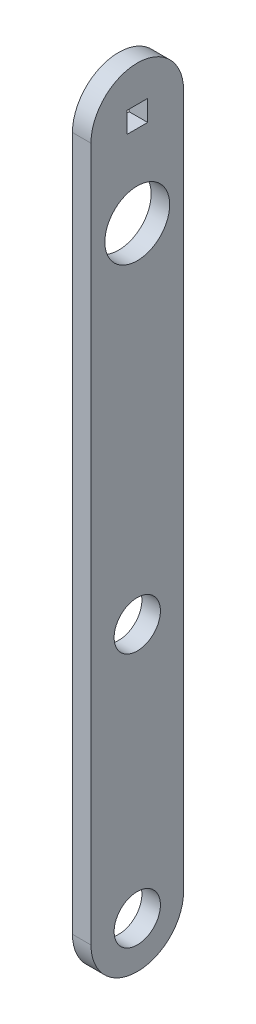
ISO-10303-21;
HEADER;
FILE_DESCRIPTION(('STEP AP214'),'2;1');
FILE_NAME('part.step','',(''),(''),'','','');
FILE_SCHEMA(('AUTOMOTIVE_DESIGN { 1 0 10303 214 1 1 1 1 }'));
ENDSEC;
DATA;
#1=APPLICATION_CONTEXT('core data for automotive mechanical design processes');
#2=APPLICATION_PROTOCOL_DEFINITION('international standard','automotive_design',2000,#1);
#3=PRODUCT_CONTEXT('',#1,'mechanical');
#4=PRODUCT('Part','Part','',(#3));
#5=PRODUCT_RELATED_PRODUCT_CATEGORY('part','',(#4));
#6=PRODUCT_DEFINITION_FORMATION('','',#4);
#7=PRODUCT_DEFINITION_CONTEXT('part definition',#1,'design');
#8=PRODUCT_DEFINITION('design','',#6,#7);
#9=PRODUCT_DEFINITION_SHAPE('','',#8);
#10=(LENGTH_UNIT() NAMED_UNIT(*) SI_UNIT(.MILLI.,.METRE.));
#11=(NAMED_UNIT(*) PLANE_ANGLE_UNIT() SI_UNIT($,.RADIAN.));
#12=(NAMED_UNIT(*) SI_UNIT($,.STERADIAN.) SOLID_ANGLE_UNIT());
#13=UNCERTAINTY_MEASURE_WITH_UNIT(LENGTH_MEASURE(1.E-05),#10,'distance_accuracy_value','');
#14=(GEOMETRIC_REPRESENTATION_CONTEXT(3) GLOBAL_UNCERTAINTY_ASSIGNED_CONTEXT((#13)) GLOBAL_UNIT_ASSIGNED_CONTEXT((#10,
#11,#12)) REPRESENTATION_CONTEXT('',''));
#15=CARTESIAN_POINT('',(0.,0.,0.));
#16=DIRECTION('',(0.,0.,1.));
#17=DIRECTION('',(1.,0.,0.));
#18=AXIS2_PLACEMENT_3D('',#15,#16,#17);
#19=CARTESIAN_POINT('',(-4.,0.,20.));
#20=DIRECTION('',(0.,0.,1.));
#21=DIRECTION('',(0.,-1.,0.));
#22=AXIS2_PLACEMENT_3D('',#19,#20,#21);
#23=PLANE('',#22);
#24=DIRECTION('',(1.,0.,0.));
#25=VECTOR('',#24,1.);
#26=CARTESIAN_POINT('',(-4.,-260.,20.));
#27=LINE('',#26,#25);
#28=CARTESIAN_POINT('',(-4.,-260.,20.));
#29=VERTEX_POINT('',#28);
#30=CARTESIAN_POINT('',(4.,-260.,20.));
#31=VERTEX_POINT('',#30);
#32=EDGE_CURVE('E176',#29,#31,#27,.T.);
#33=ORIENTED_EDGE('',*,*,#32,.T.);
#34=DIRECTION('',(0.,-1.,0.));
#35=VECTOR('',#34,1.);
#36=CARTESIAN_POINT('',(4.,0.,20.));
#37=LINE('',#36,#35);
#38=CARTESIAN_POINT('',(4.,40.,20.));
#39=VERTEX_POINT('',#38);
#40=EDGE_CURVE('E136',#39,#31,#37,.T.);
#41=ORIENTED_EDGE('',*,*,#40,.F.);
#42=DIRECTION('',(1.,0.,0.));
#43=VECTOR('',#42,1.);
#44=CARTESIAN_POINT('',(-4.,40.,20.));
#45=LINE('',#44,#43);
#46=CARTESIAN_POINT('',(-4.,40.,20.));
#47=VERTEX_POINT('',#46);
#48=EDGE_CURVE('E11',#47,#39,#45,.T.);
#49=ORIENTED_EDGE('',*,*,#48,.F.);
#50=DIRECTION('',(0.,-1.,0.));
#51=VECTOR('',#50,1.);
#52=CARTESIAN_POINT('',(-4.,0.,20.));
#53=LINE('',#52,#51);
#54=EDGE_CURVE('E166',#47,#29,#53,.T.);
#55=ORIENTED_EDGE('',*,*,#54,.T.);
#56=EDGE_LOOP('',(#33,#41,#49,#55));
#57=FACE_BOUND('',#56,.T.);
#58=ADVANCED_FACE('F34',(#57),#23,.T.);
#59=CARTESIAN_POINT('',(-4.,40.,0.));
#60=DIRECTION('',(1.,0.,0.));
#61=DIRECTION('',(0.,0.,-1.));
#62=AXIS2_PLACEMENT_3D('',#59,#60,#61);
#63=CYLINDRICAL_SURFACE('',#62,20.);
#64=ORIENTED_EDGE('',*,*,#48,.T.);
#65=CARTESIAN_POINT('',(4.,40.,0.));
#66=DIRECTION('',(1.,0.,0.));
#67=DIRECTION('',(0.,0.,-1.));
#68=AXIS2_PLACEMENT_3D('',#65,#66,#67);
#69=CIRCLE('',#68,20.);
#70=CARTESIAN_POINT('',(4.,40.,-20.));
#71=VERTEX_POINT('',#70);
#72=EDGE_CURVE('E145',#39,#71,#69,.F.);
#73=ORIENTED_EDGE('',*,*,#72,.T.);
#74=DIRECTION('',(1.,0.,0.));
#75=VECTOR('',#74,1.);
#76=CARTESIAN_POINT('',(-4.,40.,-20.));
#77=LINE('',#76,#75);
#78=CARTESIAN_POINT('',(-4.,40.,-20.));
#79=VERTEX_POINT('',#78);
#80=EDGE_CURVE('E43',#79,#71,#77,.T.);
#81=ORIENTED_EDGE('',*,*,#80,.F.);
#82=CARTESIAN_POINT('',(-4.,40.,0.));
#83=DIRECTION('',(1.,0.,0.));
#84=DIRECTION('',(0.,0.,-1.));
#85=AXIS2_PLACEMENT_3D('',#82,#83,#84);
#86=CIRCLE('',#85,20.);
#87=EDGE_CURVE('E110',#47,#79,#86,.F.);
#88=ORIENTED_EDGE('',*,*,#87,.F.);
#89=EDGE_LOOP('',(#64,#73,#81,#88));
#90=FACE_BOUND('',#89,.T.);
#91=ADVANCED_FACE('F207',(#90),#63,.T.);
#92=CARTESIAN_POINT('',(-4.,0.,-20.));
#93=DIRECTION('',(0.,0.,1.));
#94=DIRECTION('',(0.,-1.,0.));
#95=AXIS2_PLACEMENT_3D('',#92,#93,#94);
#96=PLANE('',#95);
#97=ORIENTED_EDGE('',*,*,#80,.T.);
#98=DIRECTION('',(0.,-1.,0.));
#99=VECTOR('',#98,1.);
#100=CARTESIAN_POINT('',(4.,0.,-20.));
#101=LINE('',#100,#99);
#102=CARTESIAN_POINT('',(4.,-260.,-20.));
#103=VERTEX_POINT('',#102);
#104=EDGE_CURVE('E142',#71,#103,#101,.T.);
#105=ORIENTED_EDGE('',*,*,#104,.T.);
#106=DIRECTION('',(1.,0.,0.));
#107=VECTOR('',#106,1.);
#108=CARTESIAN_POINT('',(-4.,-260.,-20.));
#109=LINE('',#108,#107);
#110=CARTESIAN_POINT('',(-4.,-260.,-20.));
#111=VERTEX_POINT('',#110);
#112=EDGE_CURVE('E174',#111,#103,#109,.T.);
#113=ORIENTED_EDGE('',*,*,#112,.F.);
#114=DIRECTION('',(0.,-1.,0.));
#115=VECTOR('',#114,1.);
#116=CARTESIAN_POINT('',(-4.,0.,-20.));
#117=LINE('',#116,#115);
#118=EDGE_CURVE('E57',#79,#111,#117,.T.);
#119=ORIENTED_EDGE('',*,*,#118,.F.);
#120=EDGE_LOOP('',(#97,#105,#113,#119));
#121=FACE_BOUND('',#120,.T.);
#122=ADVANCED_FACE('F208',(#121),#96,.F.);
#123=CARTESIAN_POINT('',(-4.,0.,-4.5));
#124=DIRECTION('',(0.,0.,-1.));
#125=DIRECTION('',(-1.,0.,0.));
#126=AXIS2_PLACEMENT_3D('',#123,#124,#125);
#127=PLANE('',#126);
#128=DIRECTION('',(1.,0.,0.));
#129=VECTOR('',#128,1.);
#130=CARTESIAN_POINT('',(-4.,35.5,-4.5));
#131=LINE('',#130,#129);
#132=CARTESIAN_POINT('',(-4.,35.5,-4.5));
#133=VERTEX_POINT('',#132);
#134=CARTESIAN_POINT('',(4.,35.5,-4.5));
#135=VERTEX_POINT('',#134);
#136=EDGE_CURVE('E38',#133,#135,#131,.T.);
#137=ORIENTED_EDGE('',*,*,#136,.T.);
#138=DIRECTION('',(0.,1.,0.));
#139=VECTOR('',#138,1.);
#140=CARTESIAN_POINT('',(4.,0.,-4.5));
#141=LINE('',#140,#139);
#142=CARTESIAN_POINT('',(4.,44.5,-4.5));
#143=VERTEX_POINT('',#142);
#144=EDGE_CURVE('E104',#135,#143,#141,.T.);
#145=ORIENTED_EDGE('',*,*,#144,.T.);
#146=DIRECTION('',(1.,0.,0.));
#147=VECTOR('',#146,1.);
#148=CARTESIAN_POINT('',(-4.,44.5,-4.5));
#149=LINE('',#148,#147);
#150=CARTESIAN_POINT('',(-4.,44.5,-4.5));
#151=VERTEX_POINT('',#150);
#152=EDGE_CURVE('E178',#151,#143,#149,.T.);
#153=ORIENTED_EDGE('',*,*,#152,.F.);
#154=DIRECTION('',(0.,1.,0.));
#155=VECTOR('',#154,1.);
#156=CARTESIAN_POINT('',(-4.,0.,-4.5));
#157=LINE('',#156,#155);
#158=EDGE_CURVE('E105',#133,#151,#157,.T.);
#159=ORIENTED_EDGE('',*,*,#158,.F.);
#160=EDGE_LOOP('',(#137,#145,#153,#159));
#161=FACE_BOUND('',#160,.T.);
#162=ADVANCED_FACE('F102',(#161),#127,.F.);
#163=CARTESIAN_POINT('',(-4.,44.5,0.));
#164=DIRECTION('',(0.,-1.,0.));
#165=DIRECTION('',(0.,0.,-1.));
#166=AXIS2_PLACEMENT_3D('',#163,#164,#165);
#167=PLANE('',#166);
#168=ORIENTED_EDGE('',*,*,#152,.T.);
#169=DIRECTION('',(0.,0.,-1.));
#170=VECTOR('',#169,1.);
#171=CARTESIAN_POINT('',(4.,44.5,0.));
#172=LINE('',#171,#170);
#173=CARTESIAN_POINT('',(4.,44.5,4.5));
#174=VERTEX_POINT('',#173);
#175=EDGE_CURVE('E119',#174,#143,#172,.T.);
#176=ORIENTED_EDGE('',*,*,#175,.F.);
#177=DIRECTION('',(1.,0.,0.));
#178=VECTOR('',#177,1.);
#179=CARTESIAN_POINT('',(-4.,44.5,4.5));
#180=LINE('',#179,#178);
#181=CARTESIAN_POINT('',(-4.,44.5,4.5));
#182=VERTEX_POINT('',#181);
#183=EDGE_CURVE('E180',#182,#174,#180,.T.);
#184=ORIENTED_EDGE('',*,*,#183,.F.);
#185=DIRECTION('',(0.,0.,-1.));
#186=VECTOR('',#185,1.);
#187=CARTESIAN_POINT('',(-4.,44.5,0.));
#188=LINE('',#187,#186);
#189=EDGE_CURVE('E157',#182,#151,#188,.T.);
#190=ORIENTED_EDGE('',*,*,#189,.T.);
#191=EDGE_LOOP('',(#168,#176,#184,#190));
#192=FACE_BOUND('',#191,.T.);
#193=ADVANCED_FACE('F186',(#192),#167,.T.);
#194=CARTESIAN_POINT('',(-4.,0.,4.5));
#195=DIRECTION('',(0.,0.,-1.));
#196=DIRECTION('',(-1.,0.,0.));
#197=AXIS2_PLACEMENT_3D('',#194,#195,#196);
#198=PLANE('',#197);
#199=ORIENTED_EDGE('',*,*,#183,.T.);
#200=DIRECTION('',(0.,1.,0.));
#201=VECTOR('',#200,1.);
#202=CARTESIAN_POINT('',(4.,0.,4.5));
#203=LINE('',#202,#201);
#204=CARTESIAN_POINT('',(4.,35.5,4.5));
#205=VERTEX_POINT('',#204);
#206=EDGE_CURVE('E124',#205,#174,#203,.T.);
#207=ORIENTED_EDGE('',*,*,#206,.F.);
#208=DIRECTION('',(1.,0.,0.));
#209=VECTOR('',#208,1.);
#210=CARTESIAN_POINT('',(-4.,35.5,4.5));
#211=LINE('',#210,#209);
#212=CARTESIAN_POINT('',(-4.,35.5,4.5));
#213=VERTEX_POINT('',#212);
#214=EDGE_CURVE('E109',#213,#205,#211,.T.);
#215=ORIENTED_EDGE('',*,*,#214,.F.);
#216=DIRECTION('',(0.,1.,0.));
#217=VECTOR('',#216,1.);
#218=CARTESIAN_POINT('',(-4.,0.,4.5));
#219=LINE('',#218,#217);
#220=EDGE_CURVE('E154',#213,#182,#219,.T.);
#221=ORIENTED_EDGE('',*,*,#220,.T.);
#222=EDGE_LOOP('',(#199,#207,#215,#221));
#223=FACE_BOUND('',#222,.T.);
#224=ADVANCED_FACE('F182',(#223),#198,.T.);
#225=CARTESIAN_POINT('',(-4.,-150.,0.));
#226=DIRECTION('',(1.,0.,0.));
#227=DIRECTION('',(0.,0.,-1.));
#228=AXIS2_PLACEMENT_3D('',#225,#226,#227);
#229=CYLINDRICAL_SURFACE('',#228,10.);
#230=CARTESIAN_POINT('',(-4.,-150.,0.));
#231=DIRECTION('',(1.,0.,0.));
#232=DIRECTION('',(0.,0.,-1.));
#233=AXIS2_PLACEMENT_3D('',#230,#231,#232);
#234=CIRCLE('',#233,10.);
#235=CARTESIAN_POINT('',(-4.,-150.,-10.));
#236=VERTEX_POINT('',#235);
#237=EDGE_CURVE('E163',#236,#236,#234,.T.);
#238=ORIENTED_EDGE('',*,*,#237,.F.);
#239=EDGE_LOOP('',(#238));
#240=FACE_BOUND('',#239,.T.);
#241=CARTESIAN_POINT('',(4.,-150.,0.));
#242=DIRECTION('',(1.,0.,0.));
#243=DIRECTION('',(0.,0.,-1.));
#244=AXIS2_PLACEMENT_3D('',#241,#242,#243);
#245=CIRCLE('',#244,10.);
#246=CARTESIAN_POINT('',(4.,-150.,-10.));
#247=VERTEX_POINT('',#246);
#248=EDGE_CURVE('E133',#247,#247,#245,.T.);
#249=ORIENTED_EDGE('',*,*,#248,.T.);
#250=EDGE_LOOP('',(#249));
#251=FACE_BOUND('',#250,.T.);
#252=ADVANCED_FACE('F222',(#240,#251),#229,.F.);
#253=CARTESIAN_POINT('',(-4.,0.,0.));
#254=DIRECTION('',(1.,0.,0.));
#255=DIRECTION('',(0.,0.,-1.));
#256=AXIS2_PLACEMENT_3D('',#253,#254,#255);
#257=CYLINDRICAL_SURFACE('',#256,14.);
#258=CARTESIAN_POINT('',(-4.,0.,0.));
#259=DIRECTION('',(1.,0.,0.));
#260=DIRECTION('',(0.,0.,-1.));
#261=AXIS2_PLACEMENT_3D('',#258,#259,#260);
#262=CIRCLE('',#261,14.);
#263=CARTESIAN_POINT('',(-4.,0.,-14.));
#264=VERTEX_POINT('',#263);
#265=EDGE_CURVE('E160',#264,#264,#262,.T.);
#266=ORIENTED_EDGE('',*,*,#265,.F.);
#267=EDGE_LOOP('',(#266));
#268=FACE_BOUND('',#267,.T.);
#269=CARTESIAN_POINT('',(4.,0.,0.));
#270=DIRECTION('',(1.,0.,0.));
#271=DIRECTION('',(0.,0.,-1.));
#272=AXIS2_PLACEMENT_3D('',#269,#270,#271);
#273=CIRCLE('',#272,14.);
#274=CARTESIAN_POINT('',(4.,0.,-14.));
#275=VERTEX_POINT('',#274);
#276=EDGE_CURVE('E130',#275,#275,#273,.T.);
#277=ORIENTED_EDGE('',*,*,#276,.T.);
#278=EDGE_LOOP('',(#277));
#279=FACE_BOUND('',#278,.T.);
#280=ADVANCED_FACE('F225',(#268,#279),#257,.F.);
#281=CARTESIAN_POINT('',(-4.,35.5,0.));
#282=DIRECTION('',(0.,-1.,0.));
#283=DIRECTION('',(0.,0.,-1.));
#284=AXIS2_PLACEMENT_3D('',#281,#282,#283);
#285=PLANE('',#284);
#286=ORIENTED_EDGE('',*,*,#214,.T.);
#287=DIRECTION('',(0.,0.,-1.));
#288=VECTOR('',#287,1.);
#289=CARTESIAN_POINT('',(4.,35.5,0.));
#290=LINE('',#289,#288);
#291=EDGE_CURVE('E117',#205,#135,#290,.T.);
#292=ORIENTED_EDGE('',*,*,#291,.T.);
#293=ORIENTED_EDGE('',*,*,#136,.F.);
#294=DIRECTION('',(0.,0.,-1.));
#295=VECTOR('',#294,1.);
#296=CARTESIAN_POINT('',(-4.,35.5,0.));
#297=LINE('',#296,#295);
#298=EDGE_CURVE('E152',#213,#133,#297,.T.);
#299=ORIENTED_EDGE('',*,*,#298,.F.);
#300=EDGE_LOOP('',(#286,#292,#293,#299));
#301=FACE_BOUND('',#300,.T.);
#302=ADVANCED_FACE('F122',(#301),#285,.F.);
#303=CARTESIAN_POINT('',(-4.,-260.,0.));
#304=DIRECTION('',(1.,0.,0.));
#305=DIRECTION('',(0.,0.,-1.));
#306=AXIS2_PLACEMENT_3D('',#303,#304,#305);
#307=CYLINDRICAL_SURFACE('',#306,10.);
#308=CARTESIAN_POINT('',(-4.,-260.,0.));
#309=DIRECTION('',(1.,0.,0.));
#310=DIRECTION('',(0.,0.,-1.));
#311=AXIS2_PLACEMENT_3D('',#308,#309,#310);
#312=CIRCLE('',#311,10.);
#313=CARTESIAN_POINT('',(-4.,-260.,-10.));
#314=VERTEX_POINT('',#313);
#315=EDGE_CURVE('E148',#314,#314,#312,.T.);
#316=ORIENTED_EDGE('',*,*,#315,.F.);
#317=EDGE_LOOP('',(#316));
#318=FACE_BOUND('',#317,.T.);
#319=CARTESIAN_POINT('',(4.,-260.,0.));
#320=DIRECTION('',(1.,0.,0.));
#321=DIRECTION('',(0.,0.,-1.));
#322=AXIS2_PLACEMENT_3D('',#319,#320,#321);
#323=CIRCLE('',#322,10.);
#324=CARTESIAN_POINT('',(4.,-260.,-10.));
#325=VERTEX_POINT('',#324);
#326=EDGE_CURVE('E120',#325,#325,#323,.T.);
#327=ORIENTED_EDGE('',*,*,#326,.T.);
#328=EDGE_LOOP('',(#327));
#329=FACE_BOUND('',#328,.T.);
#330=ADVANCED_FACE('F36',(#318,#329),#307,.F.);
#331=CARTESIAN_POINT('',(-4.,-260.,0.));
#332=DIRECTION('',(1.,0.,0.));
#333=DIRECTION('',(0.,0.,-1.));
#334=AXIS2_PLACEMENT_3D('',#331,#332,#333);
#335=CYLINDRICAL_SURFACE('',#334,20.);
#336=ORIENTED_EDGE('',*,*,#112,.T.);
#337=CARTESIAN_POINT('',(4.,-260.,0.));
#338=DIRECTION('',(1.,0.,0.));
#339=DIRECTION('',(0.,0.,-1.));
#340=AXIS2_PLACEMENT_3D('',#337,#338,#339);
#341=CIRCLE('',#340,20.);
#342=EDGE_CURVE('E139',#31,#103,#341,.T.);
#343=ORIENTED_EDGE('',*,*,#342,.F.);
#344=ORIENTED_EDGE('',*,*,#32,.F.);
#345=CARTESIAN_POINT('',(-4.,-260.,0.));
#346=DIRECTION('',(1.,0.,0.));
#347=DIRECTION('',(0.,0.,-1.));
#348=AXIS2_PLACEMENT_3D('',#345,#346,#347);
#349=CIRCLE('',#348,20.);
#350=EDGE_CURVE('E168',#29,#111,#349,.T.);
#351=ORIENTED_EDGE('',*,*,#350,.T.);
#352=EDGE_LOOP('',(#336,#343,#344,#351));
#353=FACE_BOUND('',#352,.T.);
#354=ADVANCED_FACE('F191',(#353),#335,.T.);
#355=CARTESIAN_POINT('',(-4.,0.,0.));
#356=DIRECTION('',(1.,0.,0.));
#357=DIRECTION('',(0.,0.,-1.));
#358=AXIS2_PLACEMENT_3D('',#355,#356,#357);
#359=PLANE('',#358);
#360=ORIENTED_EDGE('',*,*,#315,.T.);
#361=EDGE_LOOP('',(#360));
#362=FACE_BOUND('',#361,.T.);
#363=ORIENTED_EDGE('',*,*,#158,.T.);
#364=ORIENTED_EDGE('',*,*,#189,.F.);
#365=ORIENTED_EDGE('',*,*,#220,.F.);
#366=ORIENTED_EDGE('',*,*,#298,.T.);
#367=EDGE_LOOP('',(#363,#364,#365,#366));
#368=FACE_BOUND('',#367,.T.);
#369=ORIENTED_EDGE('',*,*,#265,.T.);
#370=EDGE_LOOP('',(#369));
#371=FACE_BOUND('',#370,.T.);
#372=ORIENTED_EDGE('',*,*,#237,.T.);
#373=EDGE_LOOP('',(#372));
#374=FACE_BOUND('',#373,.T.);
#375=ORIENTED_EDGE('',*,*,#54,.F.);
#376=ORIENTED_EDGE('',*,*,#87,.T.);
#377=ORIENTED_EDGE('',*,*,#118,.T.);
#378=ORIENTED_EDGE('',*,*,#350,.F.);
#379=EDGE_LOOP('',(#375,#376,#377,#378));
#380=FACE_BOUND('',#379,.T.);
#381=ADVANCED_FACE('F188',(#362,#368,#371,#374,#380),#359,.F.);
#382=CARTESIAN_POINT('',(4.,0.,0.));
#383=DIRECTION('',(1.,0.,0.));
#384=DIRECTION('',(0.,0.,-1.));
#385=AXIS2_PLACEMENT_3D('',#382,#383,#384);
#386=PLANE('',#385);
#387=ORIENTED_EDGE('',*,*,#326,.F.);
#388=EDGE_LOOP('',(#387));
#389=FACE_BOUND('',#388,.T.);
#390=ORIENTED_EDGE('',*,*,#144,.F.);
#391=ORIENTED_EDGE('',*,*,#291,.F.);
#392=ORIENTED_EDGE('',*,*,#206,.T.);
#393=ORIENTED_EDGE('',*,*,#175,.T.);
#394=EDGE_LOOP('',(#390,#391,#392,#393));
#395=FACE_BOUND('',#394,.T.);
#396=ORIENTED_EDGE('',*,*,#276,.F.);
#397=EDGE_LOOP('',(#396));
#398=FACE_BOUND('',#397,.T.);
#399=ORIENTED_EDGE('',*,*,#248,.F.);
#400=EDGE_LOOP('',(#399));
#401=FACE_BOUND('',#400,.T.);
#402=ORIENTED_EDGE('',*,*,#40,.T.);
#403=ORIENTED_EDGE('',*,*,#342,.T.);
#404=ORIENTED_EDGE('',*,*,#104,.F.);
#405=ORIENTED_EDGE('',*,*,#72,.F.);
#406=EDGE_LOOP('',(#402,#403,#404,#405));
#407=FACE_BOUND('',#406,.T.);
#408=ADVANCED_FACE('F114',(#389,#395,#398,#401,#407),#386,.T.);
#409=CLOSED_SHELL('',(#58,#91,#122,#162,#193,#224,#252,#280,#302,#330,#354,#381,#408));
#410=MANIFOLD_SOLID_BREP('B2',#409);
#411=ADVANCED_BREP_SHAPE_REPRESENTATION('',(#18,#410),#14);
#412=SHAPE_DEFINITION_REPRESENTATION(#9,#411);
ENDSEC;
END-ISO-10303-21;
